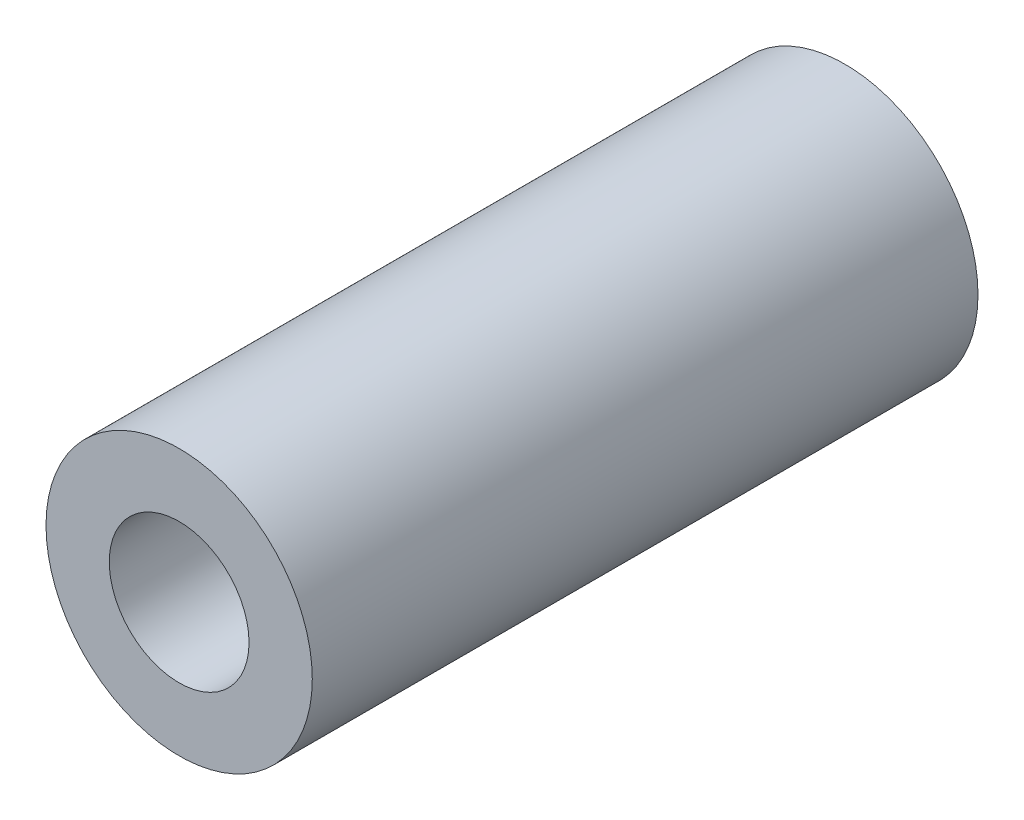
ISO-10303-21;
HEADER;
FILE_DESCRIPTION(('STEP AP214'),'2;1');
FILE_NAME('part.step','',(''),(''),'','','');
FILE_SCHEMA(('AUTOMOTIVE_DESIGN { 1 0 10303 214 1 1 1 1 }'));
ENDSEC;
DATA;
#1=APPLICATION_CONTEXT('core data for automotive mechanical design processes');
#2=APPLICATION_PROTOCOL_DEFINITION('international standard','automotive_design',2000,#1);
#3=PRODUCT_CONTEXT('',#1,'mechanical');
#4=PRODUCT('Part','Part','',(#3));
#5=PRODUCT_RELATED_PRODUCT_CATEGORY('part','',(#4));
#6=PRODUCT_DEFINITION_FORMATION('','',#4);
#7=PRODUCT_DEFINITION_CONTEXT('part definition',#1,'design');
#8=PRODUCT_DEFINITION('design','',#6,#7);
#9=PRODUCT_DEFINITION_SHAPE('','',#8);
#10=(LENGTH_UNIT() NAMED_UNIT(*) SI_UNIT(.MILLI.,.METRE.));
#11=(NAMED_UNIT(*) PLANE_ANGLE_UNIT() SI_UNIT($,.RADIAN.));
#12=(NAMED_UNIT(*) SI_UNIT($,.STERADIAN.) SOLID_ANGLE_UNIT());
#13=UNCERTAINTY_MEASURE_WITH_UNIT(LENGTH_MEASURE(1.E-05),#10,'distance_accuracy_value','');
#14=(GEOMETRIC_REPRESENTATION_CONTEXT(3) GLOBAL_UNCERTAINTY_ASSIGNED_CONTEXT((#13)) GLOBAL_UNIT_ASSIGNED_CONTEXT((#10,
#11,#12)) REPRESENTATION_CONTEXT('',''));
#15=CARTESIAN_POINT('',(0.,0.,0.));
#16=DIRECTION('',(0.,0.,1.));
#17=DIRECTION('',(1.,0.,0.));
#18=AXIS2_PLACEMENT_3D('',#15,#16,#17);
#19=CARTESIAN_POINT('',(0.,0.,50.));
#20=DIRECTION('',(0.,0.,1.));
#21=DIRECTION('',(1.,0.,0.));
#22=AXIS2_PLACEMENT_3D('',#19,#20,#21);
#23=PLANE('',#22);
#24=CARTESIAN_POINT('',(0.,0.,50.));
#25=DIRECTION('',(0.,0.,1.));
#26=DIRECTION('',(1.,0.,0.));
#27=AXIS2_PLACEMENT_3D('',#24,#25,#26);
#28=CIRCLE('',#27,10.);
#29=CARTESIAN_POINT('',(10.,0.,50.));
#30=VERTEX_POINT('',#29);
#31=EDGE_CURVE('E10',#30,#30,#28,.T.);
#32=ORIENTED_EDGE('',*,*,#31,.T.);
#33=EDGE_LOOP('',(#32));
#34=FACE_BOUND('',#33,.T.);
#35=CARTESIAN_POINT('',(0.,0.,50.));
#36=DIRECTION('',(0.,0.,1.));
#37=DIRECTION('',(1.,0.,0.));
#38=AXIS2_PLACEMENT_3D('',#35,#36,#37);
#39=CIRCLE('',#38,5.25);
#40=CARTESIAN_POINT('',(5.25,0.,50.));
#41=VERTEX_POINT('',#40);
#42=EDGE_CURVE('E41',#41,#41,#39,.T.);
#43=ORIENTED_EDGE('',*,*,#42,.F.);
#44=EDGE_LOOP('',(#43));
#45=FACE_BOUND('',#44,.T.);
#46=ADVANCED_FACE('F30',(#34,#45),#23,.T.);
#47=CARTESIAN_POINT('',(0.,0.,0.));
#48=DIRECTION('',(0.,0.,1.));
#49=DIRECTION('',(1.,0.,0.));
#50=AXIS2_PLACEMENT_3D('',#47,#48,#49);
#51=PLANE('',#50);
#52=CARTESIAN_POINT('',(0.,0.,0.));
#53=DIRECTION('',(0.,0.,1.));
#54=DIRECTION('',(1.,0.,0.));
#55=AXIS2_PLACEMENT_3D('',#52,#53,#54);
#56=CIRCLE('',#55,10.);
#57=CARTESIAN_POINT('',(10.,0.,0.));
#58=VERTEX_POINT('',#57);
#59=EDGE_CURVE('E34',#58,#58,#56,.T.);
#60=ORIENTED_EDGE('',*,*,#59,.F.);
#61=EDGE_LOOP('',(#60));
#62=FACE_BOUND('',#61,.T.);
#63=CARTESIAN_POINT('',(0.,0.,0.));
#64=DIRECTION('',(0.,0.,1.));
#65=DIRECTION('',(1.,0.,0.));
#66=AXIS2_PLACEMENT_3D('',#63,#64,#65);
#67=CIRCLE('',#66,5.25);
#68=CARTESIAN_POINT('',(5.25,0.,0.));
#69=VERTEX_POINT('',#68);
#70=EDGE_CURVE('E43',#69,#69,#67,.T.);
#71=ORIENTED_EDGE('',*,*,#70,.T.);
#72=EDGE_LOOP('',(#71));
#73=FACE_BOUND('',#72,.T.);
#74=ADVANCED_FACE('F53',(#62,#73),#51,.F.);
#75=CARTESIAN_POINT('',(0.,0.,50.));
#76=DIRECTION('',(0.,0.,-1.));
#77=DIRECTION('',(-1.,0.,0.));
#78=AXIS2_PLACEMENT_3D('',#75,#76,#77);
#79=CYLINDRICAL_SURFACE('',#78,10.);
#80=ORIENTED_EDGE('',*,*,#31,.F.);
#81=EDGE_LOOP('',(#80));
#82=FACE_BOUND('',#81,.T.);
#83=ORIENTED_EDGE('',*,*,#59,.T.);
#84=EDGE_LOOP('',(#83));
#85=FACE_BOUND('',#84,.T.);
#86=ADVANCED_FACE('F32',(#82,#85),#79,.T.);
#87=CARTESIAN_POINT('',(0.,0.,50.));
#88=DIRECTION('',(0.,0.,-1.));
#89=DIRECTION('',(-1.,0.,0.));
#90=AXIS2_PLACEMENT_3D('',#87,#88,#89);
#91=CYLINDRICAL_SURFACE('',#90,5.25);
#92=ORIENTED_EDGE('',*,*,#42,.T.);
#93=EDGE_LOOP('',(#92));
#94=FACE_BOUND('',#93,.T.);
#95=ORIENTED_EDGE('',*,*,#70,.F.);
#96=EDGE_LOOP('',(#95));
#97=FACE_BOUND('',#96,.T.);
#98=ADVANCED_FACE('F49',(#94,#97),#91,.F.);
#99=CLOSED_SHELL('',(#46,#74,#86,#98));
#100=MANIFOLD_SOLID_BREP('B2',#99);
#101=ADVANCED_BREP_SHAPE_REPRESENTATION('',(#18,#100),#14);
#102=SHAPE_DEFINITION_REPRESENTATION(#9,#101);
ENDSEC;
END-ISO-10303-21;
